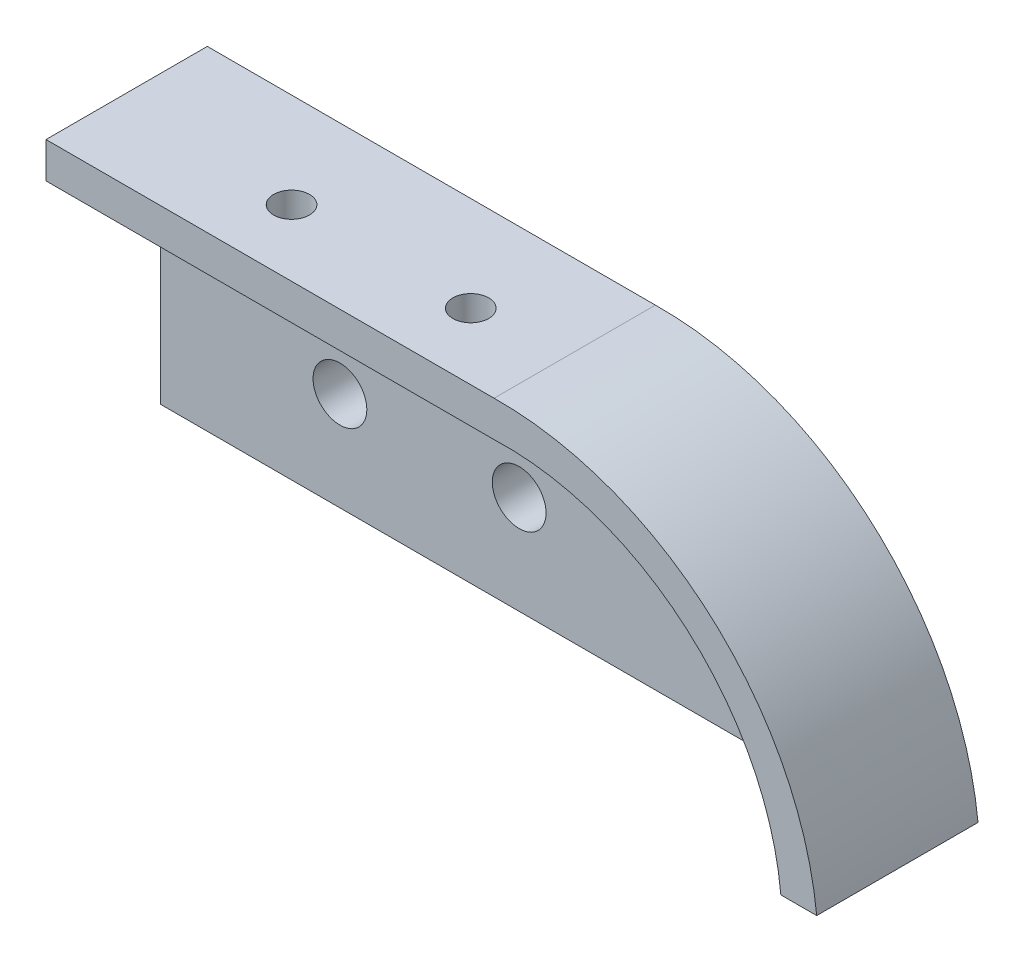
ISO-10303-21;
HEADER;
FILE_DESCRIPTION(('STEP AP214'),'2;1');
FILE_NAME('part.step','',(''),(''),'','','');
FILE_SCHEMA(('AUTOMOTIVE_DESIGN { 1 0 10303 214 1 1 1 1 }'));
ENDSEC;
DATA;
#1=APPLICATION_CONTEXT('core data for automotive mechanical design processes');
#2=APPLICATION_PROTOCOL_DEFINITION('international standard','automotive_design',2000,#1);
#3=PRODUCT_CONTEXT('',#1,'mechanical');
#4=PRODUCT('Part','Part','',(#3));
#5=PRODUCT_RELATED_PRODUCT_CATEGORY('part','',(#4));
#6=PRODUCT_DEFINITION_FORMATION('','',#4);
#7=PRODUCT_DEFINITION_CONTEXT('part definition',#1,'design');
#8=PRODUCT_DEFINITION('design','',#6,#7);
#9=PRODUCT_DEFINITION_SHAPE('','',#8);
#10=(LENGTH_UNIT() NAMED_UNIT(*) SI_UNIT(.MILLI.,.METRE.));
#11=(NAMED_UNIT(*) PLANE_ANGLE_UNIT() SI_UNIT($,.RADIAN.));
#12=(NAMED_UNIT(*) SI_UNIT($,.STERADIAN.) SOLID_ANGLE_UNIT());
#13=UNCERTAINTY_MEASURE_WITH_UNIT(LENGTH_MEASURE(1.E-05),#10,'distance_accuracy_value','');
#14=(GEOMETRIC_REPRESENTATION_CONTEXT(3) GLOBAL_UNCERTAINTY_ASSIGNED_CONTEXT((#13)) GLOBAL_UNIT_ASSIGNED_CONTEXT((#10,
#11,#12)) REPRESENTATION_CONTEXT('',''));
#15=CARTESIAN_POINT('',(0.,0.,0.));
#16=DIRECTION('',(0.,0.,1.));
#17=DIRECTION('',(1.,0.,0.));
#18=AXIS2_PLACEMENT_3D('',#15,#16,#17);
#19=CARTESIAN_POINT('',(12.5000000000001,8.,0.));
#20=DIRECTION('',(0.,1.,0.));
#21=DIRECTION('',(0.,0.,1.));
#22=AXIS2_PLACEMENT_3D('',#19,#20,#21);
#23=PLANE('',#22);
#24=CARTESIAN_POINT('',(5.,8.,2.65));
#25=DIRECTION('',(0.,1.,0.));
#26=DIRECTION('',(0.,0.,1.));
#27=AXIS2_PLACEMENT_3D('',#24,#25,#26);
#28=CIRCLE('',#27,0.499999999999988);
#29=CARTESIAN_POINT('',(5.,8.,3.14999999999999));
#30=VERTEX_POINT('',#29);
#31=EDGE_CURVE('E189',#30,#30,#28,.T.);
#32=ORIENTED_EDGE('',*,*,#31,.F.);
#33=EDGE_LOOP('',(#32));
#34=FACE_BOUND('',#33,.T.);
#35=CARTESIAN_POINT('',(10.,8.,2.65));
#36=DIRECTION('',(0.,1.,0.));
#37=DIRECTION('',(0.,0.,1.));
#38=AXIS2_PLACEMENT_3D('',#35,#36,#37);
#39=CIRCLE('',#38,0.499999999999988);
#40=CARTESIAN_POINT('',(10.,8.,3.14999999999999));
#41=VERTEX_POINT('',#40);
#42=EDGE_CURVE('E192',#41,#41,#39,.T.);
#43=ORIENTED_EDGE('',*,*,#42,.F.);
#44=EDGE_LOOP('',(#43));
#45=FACE_BOUND('',#44,.T.);
#46=DIRECTION('',(-1.,0.,0.));
#47=VECTOR('',#46,1.);
#48=CARTESIAN_POINT('',(12.5000000000001,8.,4.5));
#49=LINE('',#48,#47);
#50=CARTESIAN_POINT('',(12.5000000000001,8.,4.5));
#51=VERTEX_POINT('',#50);
#52=CARTESIAN_POINT('',(0.,8.,4.5));
#53=VERTEX_POINT('',#52);
#54=EDGE_CURVE('E133',#51,#53,#49,.T.);
#55=ORIENTED_EDGE('',*,*,#54,.F.);
#56=DIRECTION('',(0.,0.,1.));
#57=VECTOR('',#56,1.);
#58=CARTESIAN_POINT('',(12.5000000000001,8.,0.));
#59=LINE('',#58,#57);
#60=CARTESIAN_POINT('',(12.5000000000001,8.,0.));
#61=VERTEX_POINT('',#60);
#62=EDGE_CURVE('E11',#61,#51,#59,.T.);
#63=ORIENTED_EDGE('',*,*,#62,.F.);
#64=DIRECTION('',(-1.,0.,0.));
#65=VECTOR('',#64,1.);
#66=CARTESIAN_POINT('',(12.5000000000001,8.,0.));
#67=LINE('',#66,#65);
#68=CARTESIAN_POINT('',(0.,8.,0.));
#69=VERTEX_POINT('',#68);
#70=EDGE_CURVE('E135',#61,#69,#67,.T.);
#71=ORIENTED_EDGE('',*,*,#70,.T.);
#72=DIRECTION('',(0.,0.,1.));
#73=VECTOR('',#72,1.);
#74=CARTESIAN_POINT('',(0.,8.,0.));
#75=LINE('',#74,#73);
#76=EDGE_CURVE('E81',#69,#53,#75,.T.);
#77=ORIENTED_EDGE('',*,*,#76,.T.);
#78=EDGE_LOOP('',(#55,#63,#71,#77));
#79=FACE_BOUND('',#78,.T.);
#80=ADVANCED_FACE('F35',(#34,#45,#79),#23,.T.);
#81=CARTESIAN_POINT('',(12.6198469528069,-0.92767217809221,0.));
#82=DIRECTION('',(0.,0.,1.));
#83=DIRECTION('',(1.,0.,0.));
#84=AXIS2_PLACEMENT_3D('',#81,#82,#83);
#85=CYLINDRICAL_SURFACE('',#84,8.9284765672302);
#86=CARTESIAN_POINT('',(12.6198469528069,-0.92767217809221,4.5));
#87=DIRECTION('',(0.,0.,1.));
#88=DIRECTION('',(1.,0.,0.));
#89=AXIS2_PLACEMENT_3D('',#86,#87,#88);
#90=CIRCLE('',#89,8.9284765672302);
#91=CARTESIAN_POINT('',(21.5,0.,4.5));
#92=VERTEX_POINT('',#91);
#93=EDGE_CURVE('E138',#92,#51,#90,.T.);
#94=ORIENTED_EDGE('',*,*,#93,.F.);
#95=DIRECTION('',(0.,0.,1.));
#96=VECTOR('',#95,1.);
#97=CARTESIAN_POINT('',(21.5,0.,0.));
#98=LINE('',#97,#96);
#99=CARTESIAN_POINT('',(21.5,0.,0.));
#100=VERTEX_POINT('',#99);
#101=EDGE_CURVE('E43',#100,#92,#98,.T.);
#102=ORIENTED_EDGE('',*,*,#101,.F.);
#103=CARTESIAN_POINT('',(12.6198469528069,-0.92767217809221,0.));
#104=DIRECTION('',(0.,0.,1.));
#105=DIRECTION('',(1.,0.,0.));
#106=AXIS2_PLACEMENT_3D('',#103,#104,#105);
#107=CIRCLE('',#106,8.9284765672302);
#108=EDGE_CURVE('E143',#100,#61,#107,.T.);
#109=ORIENTED_EDGE('',*,*,#108,.T.);
#110=ORIENTED_EDGE('',*,*,#62,.T.);
#111=EDGE_LOOP('',(#94,#102,#109,#110));
#112=FACE_BOUND('',#111,.T.);
#113=ADVANCED_FACE('F162',(#112),#85,.T.);
#114=CARTESIAN_POINT('',(0.,0.,0.));
#115=DIRECTION('',(0.,-1.,0.));
#116=DIRECTION('',(1.,0.,0.));
#117=AXIS2_PLACEMENT_3D('',#114,#115,#116);
#118=PLANE('',#117);
#119=DIRECTION('',(0.,0.,1.));
#120=VECTOR('',#119,1.);
#121=CARTESIAN_POINT('',(20.5,0.,1.3));
#122=LINE('',#121,#120);
#123=CARTESIAN_POINT('',(20.5,0.,1.3));
#124=VERTEX_POINT('',#123);
#125=CARTESIAN_POINT('',(20.5,0.,4.5));
#126=VERTEX_POINT('',#125);
#127=EDGE_CURVE('E131',#124,#126,#122,.T.);
#128=ORIENTED_EDGE('',*,*,#127,.F.);
#129=DIRECTION('',(1.,0.,0.));
#130=VECTOR('',#129,1.);
#131=CARTESIAN_POINT('',(0.,0.,1.3));
#132=LINE('',#131,#130);
#133=CARTESIAN_POINT('',(0.,0.,1.3));
#134=VERTEX_POINT('',#133);
#135=EDGE_CURVE('E108',#134,#124,#132,.T.);
#136=ORIENTED_EDGE('',*,*,#135,.F.);
#137=DIRECTION('',(0.,0.,1.));
#138=VECTOR('',#137,1.);
#139=CARTESIAN_POINT('',(0.,0.,0.));
#140=LINE('',#139,#138);
#141=CARTESIAN_POINT('',(0.,0.,0.));
#142=VERTEX_POINT('',#141);
#143=EDGE_CURVE('E156',#142,#134,#140,.T.);
#144=ORIENTED_EDGE('',*,*,#143,.F.);
#145=DIRECTION('',(1.,0.,0.));
#146=VECTOR('',#145,1.);
#147=CARTESIAN_POINT('',(0.,0.,0.));
#148=LINE('',#147,#146);
#149=EDGE_CURVE('E140',#142,#100,#148,.T.);
#150=ORIENTED_EDGE('',*,*,#149,.T.);
#151=ORIENTED_EDGE('',*,*,#101,.T.);
#152=DIRECTION('',(1.,0.,0.));
#153=VECTOR('',#152,1.);
#154=CARTESIAN_POINT('',(0.,0.,4.5));
#155=LINE('',#154,#153);
#156=EDGE_CURVE('E150',#126,#92,#155,.T.);
#157=ORIENTED_EDGE('',*,*,#156,.F.);
#158=EDGE_LOOP('',(#128,#136,#144,#150,#151,#157));
#159=FACE_BOUND('',#158,.T.);
#160=ADVANCED_FACE('F166',(#159),#118,.T.);
#161=CARTESIAN_POINT('',(0.,8.,0.));
#162=DIRECTION('',(-1.,0.,0.));
#163=DIRECTION('',(0.,0.,1.));
#164=AXIS2_PLACEMENT_3D('',#161,#162,#163);
#165=PLANE('',#164);
#166=DIRECTION('',(0.,0.,1.));
#167=VECTOR('',#166,1.);
#168=CARTESIAN_POINT('',(0.,7.,1.3));
#169=LINE('',#168,#167);
#170=CARTESIAN_POINT('',(0.,7.,1.3));
#171=VERTEX_POINT('',#170);
#172=CARTESIAN_POINT('',(0.,7.,4.5));
#173=VERTEX_POINT('',#172);
#174=EDGE_CURVE('E107',#171,#173,#169,.T.);
#175=ORIENTED_EDGE('',*,*,#174,.T.);
#176=DIRECTION('',(0.,-1.,0.));
#177=VECTOR('',#176,1.);
#178=CARTESIAN_POINT('',(0.,8.,4.5));
#179=LINE('',#178,#177);
#180=EDGE_CURVE('E147',#53,#173,#179,.T.);
#181=ORIENTED_EDGE('',*,*,#180,.F.);
#182=ORIENTED_EDGE('',*,*,#76,.F.);
#183=DIRECTION('',(0.,-1.,0.));
#184=VECTOR('',#183,1.);
#185=CARTESIAN_POINT('',(0.,8.,0.));
#186=LINE('',#185,#184);
#187=EDGE_CURVE('E137',#69,#142,#186,.T.);
#188=ORIENTED_EDGE('',*,*,#187,.T.);
#189=ORIENTED_EDGE('',*,*,#143,.T.);
#190=DIRECTION('',(0.,-1.,0.));
#191=VECTOR('',#190,1.);
#192=CARTESIAN_POINT('',(0.,7.,1.3));
#193=LINE('',#192,#191);
#194=EDGE_CURVE('E116',#171,#134,#193,.T.);
#195=ORIENTED_EDGE('',*,*,#194,.F.);
#196=EDGE_LOOP('',(#175,#181,#182,#188,#189,#195));
#197=FACE_BOUND('',#196,.T.);
#198=ADVANCED_FACE('F158',(#197),#165,.T.);
#199=CARTESIAN_POINT('',(12.6198469528069,-0.92767217809221,0.));
#200=DIRECTION('',(0.,0.,1.));
#201=DIRECTION('',(1.,0.,0.));
#202=AXIS2_PLACEMENT_3D('',#199,#200,#201);
#203=PLANE('',#202);
#204=CARTESIAN_POINT('',(10.,2.75,0.));
#205=DIRECTION('',(0.,0.,1.));
#206=DIRECTION('',(1.,0.,0.));
#207=AXIS2_PLACEMENT_3D('',#204,#205,#206);
#208=CIRCLE('',#207,0.749999999999989);
#209=CARTESIAN_POINT('',(10.75,2.75,0.));
#210=VERTEX_POINT('',#209);
#211=EDGE_CURVE('E204',#210,#210,#208,.T.);
#212=ORIENTED_EDGE('',*,*,#211,.T.);
#213=EDGE_LOOP('',(#212));
#214=FACE_BOUND('',#213,.T.);
#215=CARTESIAN_POINT('',(5.,2.75,0.));
#216=DIRECTION('',(0.,0.,1.));
#217=DIRECTION('',(1.,0.,0.));
#218=AXIS2_PLACEMENT_3D('',#215,#216,#217);
#219=CIRCLE('',#218,0.749999999999988);
#220=CARTESIAN_POINT('',(5.74999999999999,2.75,0.));
#221=VERTEX_POINT('',#220);
#222=EDGE_CURVE('E198',#221,#221,#219,.T.);
#223=ORIENTED_EDGE('',*,*,#222,.T.);
#224=EDGE_LOOP('',(#223));
#225=FACE_BOUND('',#224,.T.);
#226=ORIENTED_EDGE('',*,*,#70,.F.);
#227=ORIENTED_EDGE('',*,*,#108,.F.);
#228=ORIENTED_EDGE('',*,*,#149,.F.);
#229=ORIENTED_EDGE('',*,*,#187,.F.);
#230=EDGE_LOOP('',(#226,#227,#228,#229));
#231=FACE_BOUND('',#230,.T.);
#232=ADVANCED_FACE('F168',(#214,#225,#231),#203,.F.);
#233=CARTESIAN_POINT('',(12.6198469528069,-0.92767217809221,4.5));
#234=DIRECTION('',(0.,0.,1.));
#235=DIRECTION('',(1.,0.,0.));
#236=AXIS2_PLACEMENT_3D('',#233,#234,#235);
#237=PLANE('',#236);
#238=CARTESIAN_POINT('',(12.798654969706,-0.730108606050329,4.5));
#239=DIRECTION('',(0.,0.,1.));
#240=DIRECTION('',(1.,0.,0.));
#241=AXIS2_PLACEMENT_3D('',#238,#239,#240);
#242=CIRCLE('',#241,7.73587576504842);
#243=CARTESIAN_POINT('',(12.5,7.,4.5));
#244=VERTEX_POINT('',#243);
#245=EDGE_CURVE('E51',#126,#244,#242,.T.);
#246=ORIENTED_EDGE('',*,*,#245,.F.);
#247=ORIENTED_EDGE('',*,*,#156,.T.);
#248=ORIENTED_EDGE('',*,*,#93,.T.);
#249=ORIENTED_EDGE('',*,*,#54,.T.);
#250=ORIENTED_EDGE('',*,*,#180,.T.);
#251=DIRECTION('',(-1.,0.,0.));
#252=VECTOR('',#251,1.);
#253=CARTESIAN_POINT('',(12.5,7.,4.5));
#254=LINE('',#253,#252);
#255=EDGE_CURVE('E121',#244,#173,#254,.T.);
#256=ORIENTED_EDGE('',*,*,#255,.F.);
#257=EDGE_LOOP('',(#246,#247,#248,#249,#250,#256));
#258=FACE_BOUND('',#257,.T.);
#259=ADVANCED_FACE('F160',(#258),#237,.T.);
#260=CARTESIAN_POINT('',(12.798654969706,-0.730108606050329,1.3));
#261=DIRECTION('',(0.,0.,1.));
#262=DIRECTION('',(1.,0.,0.));
#263=AXIS2_PLACEMENT_3D('',#260,#261,#262);
#264=CYLINDRICAL_SURFACE('',#263,7.73587576504842);
#265=ORIENTED_EDGE('',*,*,#245,.T.);
#266=DIRECTION('',(0.,0.,1.));
#267=VECTOR('',#266,1.);
#268=CARTESIAN_POINT('',(12.5,7.,1.3));
#269=LINE('',#268,#267);
#270=CARTESIAN_POINT('',(12.5,7.,1.3));
#271=VERTEX_POINT('',#270);
#272=EDGE_CURVE('E99',#271,#244,#269,.T.);
#273=ORIENTED_EDGE('',*,*,#272,.F.);
#274=CARTESIAN_POINT('',(12.798654969706,-0.730108606050329,1.3));
#275=DIRECTION('',(0.,0.,1.));
#276=DIRECTION('',(1.,0.,0.));
#277=AXIS2_PLACEMENT_3D('',#274,#275,#276);
#278=CIRCLE('',#277,7.73587576504842);
#279=EDGE_CURVE('E103',#124,#271,#278,.T.);
#280=ORIENTED_EDGE('',*,*,#279,.F.);
#281=ORIENTED_EDGE('',*,*,#127,.T.);
#282=EDGE_LOOP('',(#265,#273,#280,#281));
#283=FACE_BOUND('',#282,.T.);
#284=ADVANCED_FACE('F101',(#283),#264,.F.);
#285=CARTESIAN_POINT('',(12.5,7.,1.3));
#286=DIRECTION('',(0.,1.,0.));
#287=DIRECTION('',(0.,0.,1.));
#288=AXIS2_PLACEMENT_3D('',#285,#286,#287);
#289=PLANE('',#288);
#290=CARTESIAN_POINT('',(5.,7.,2.65));
#291=DIRECTION('',(0.,1.,0.));
#292=DIRECTION('',(0.,0.,1.));
#293=AXIS2_PLACEMENT_3D('',#290,#291,#292);
#294=CIRCLE('',#293,0.499999999999987);
#295=CARTESIAN_POINT('',(5.,7.,3.14999999999999));
#296=VERTEX_POINT('',#295);
#297=EDGE_CURVE('E38',#296,#296,#294,.T.);
#298=ORIENTED_EDGE('',*,*,#297,.T.);
#299=EDGE_LOOP('',(#298));
#300=FACE_BOUND('',#299,.T.);
#301=CARTESIAN_POINT('',(10.,7.,2.65));
#302=DIRECTION('',(0.,1.,0.));
#303=DIRECTION('',(0.,0.,1.));
#304=AXIS2_PLACEMENT_3D('',#301,#302,#303);
#305=CIRCLE('',#304,0.499999999999987);
#306=CARTESIAN_POINT('',(10.,7.,3.14999999999999));
#307=VERTEX_POINT('',#306);
#308=EDGE_CURVE('E125',#307,#307,#305,.T.);
#309=ORIENTED_EDGE('',*,*,#308,.T.);
#310=EDGE_LOOP('',(#309));
#311=FACE_BOUND('',#310,.T.);
#312=ORIENTED_EDGE('',*,*,#255,.T.);
#313=ORIENTED_EDGE('',*,*,#174,.F.);
#314=DIRECTION('',(-1.,0.,0.));
#315=VECTOR('',#314,1.);
#316=CARTESIAN_POINT('',(12.5,7.,1.3));
#317=LINE('',#316,#315);
#318=EDGE_CURVE('E111',#271,#171,#317,.T.);
#319=ORIENTED_EDGE('',*,*,#318,.F.);
#320=ORIENTED_EDGE('',*,*,#272,.T.);
#321=EDGE_LOOP('',(#312,#313,#319,#320));
#322=FACE_BOUND('',#321,.T.);
#323=ADVANCED_FACE('F112',(#300,#311,#322),#289,.F.);
#324=CARTESIAN_POINT('',(12.798654969706,-0.730108606050329,1.3));
#325=DIRECTION('',(0.,0.,1.));
#326=DIRECTION('',(1.,0.,0.));
#327=AXIS2_PLACEMENT_3D('',#324,#325,#326);
#328=PLANE('',#327);
#329=CARTESIAN_POINT('',(10.,2.75,1.3));
#330=DIRECTION('',(0.,0.,1.));
#331=DIRECTION('',(1.,0.,0.));
#332=AXIS2_PLACEMENT_3D('',#329,#330,#331);
#333=CIRCLE('',#332,0.749999999999989);
#334=CARTESIAN_POINT('',(10.75,2.75,1.3));
#335=VERTEX_POINT('',#334);
#336=EDGE_CURVE('E206',#335,#335,#333,.T.);
#337=ORIENTED_EDGE('',*,*,#336,.F.);
#338=EDGE_LOOP('',(#337));
#339=FACE_BOUND('',#338,.T.);
#340=CARTESIAN_POINT('',(5.,2.75,1.3));
#341=DIRECTION('',(0.,0.,1.));
#342=DIRECTION('',(1.,0.,0.));
#343=AXIS2_PLACEMENT_3D('',#340,#341,#342);
#344=CIRCLE('',#343,0.749999999999989);
#345=CARTESIAN_POINT('',(5.74999999999999,2.75,1.3));
#346=VERTEX_POINT('',#345);
#347=EDGE_CURVE('E201',#346,#346,#344,.T.);
#348=ORIENTED_EDGE('',*,*,#347,.F.);
#349=EDGE_LOOP('',(#348));
#350=FACE_BOUND('',#349,.T.);
#351=ORIENTED_EDGE('',*,*,#279,.T.);
#352=ORIENTED_EDGE('',*,*,#318,.T.);
#353=ORIENTED_EDGE('',*,*,#194,.T.);
#354=ORIENTED_EDGE('',*,*,#135,.T.);
#355=EDGE_LOOP('',(#351,#352,#353,#354));
#356=FACE_BOUND('',#355,.T.);
#357=ADVANCED_FACE('F118',(#339,#350,#356),#328,.T.);
#358=CARTESIAN_POINT('',(10.,8.,2.65));
#359=DIRECTION('',(0.,1.,0.));
#360=DIRECTION('',(0.,0.,1.));
#361=AXIS2_PLACEMENT_3D('',#358,#359,#360);
#362=CYLINDRICAL_SURFACE('',#361,0.499999999999987);
#363=ORIENTED_EDGE('',*,*,#42,.T.);
#364=EDGE_LOOP('',(#363));
#365=FACE_BOUND('',#364,.T.);
#366=ORIENTED_EDGE('',*,*,#308,.F.);
#367=EDGE_LOOP('',(#366));
#368=FACE_BOUND('',#367,.T.);
#369=ADVANCED_FACE('F214',(#365,#368),#362,.F.);
#370=CARTESIAN_POINT('',(5.,8.,2.65));
#371=DIRECTION('',(0.,1.,0.));
#372=DIRECTION('',(0.,0.,1.));
#373=AXIS2_PLACEMENT_3D('',#370,#371,#372);
#374=CYLINDRICAL_SURFACE('',#373,0.499999999999987);
#375=ORIENTED_EDGE('',*,*,#31,.T.);
#376=EDGE_LOOP('',(#375));
#377=FACE_BOUND('',#376,.T.);
#378=ORIENTED_EDGE('',*,*,#297,.F.);
#379=EDGE_LOOP('',(#378));
#380=FACE_BOUND('',#379,.T.);
#381=ADVANCED_FACE('F220',(#377,#380),#374,.F.);
#382=CARTESIAN_POINT('',(5.,2.75,1.3));
#383=DIRECTION('',(0.,0.,1.));
#384=DIRECTION('',(1.,0.,0.));
#385=AXIS2_PLACEMENT_3D('',#382,#383,#384);
#386=CYLINDRICAL_SURFACE('',#385,0.749999999999988);
#387=ORIENTED_EDGE('',*,*,#222,.F.);
#388=EDGE_LOOP('',(#387));
#389=FACE_BOUND('',#388,.T.);
#390=ORIENTED_EDGE('',*,*,#347,.T.);
#391=EDGE_LOOP('',(#390));
#392=FACE_BOUND('',#391,.T.);
#393=ADVANCED_FACE('F218',(#389,#392),#386,.F.);
#394=CARTESIAN_POINT('',(10.,2.75,1.3));
#395=DIRECTION('',(0.,0.,1.));
#396=DIRECTION('',(1.,0.,0.));
#397=AXIS2_PLACEMENT_3D('',#394,#395,#396);
#398=CYLINDRICAL_SURFACE('',#397,0.749999999999989);
#399=ORIENTED_EDGE('',*,*,#211,.F.);
#400=EDGE_LOOP('',(#399));
#401=FACE_BOUND('',#400,.T.);
#402=ORIENTED_EDGE('',*,*,#336,.T.);
#403=EDGE_LOOP('',(#402));
#404=FACE_BOUND('',#403,.T.);
#405=ADVANCED_FACE('F210',(#401,#404),#398,.F.);
#406=CLOSED_SHELL('',(#80,#113,#160,#198,#232,#259,#284,#323,#357,#369,#381,#393,#405));
#407=MANIFOLD_SOLID_BREP('B2',#406);
#408=ADVANCED_BREP_SHAPE_REPRESENTATION('',(#18,#407),#14);
#409=SHAPE_DEFINITION_REPRESENTATION(#9,#408);
ENDSEC;
END-ISO-10303-21;
